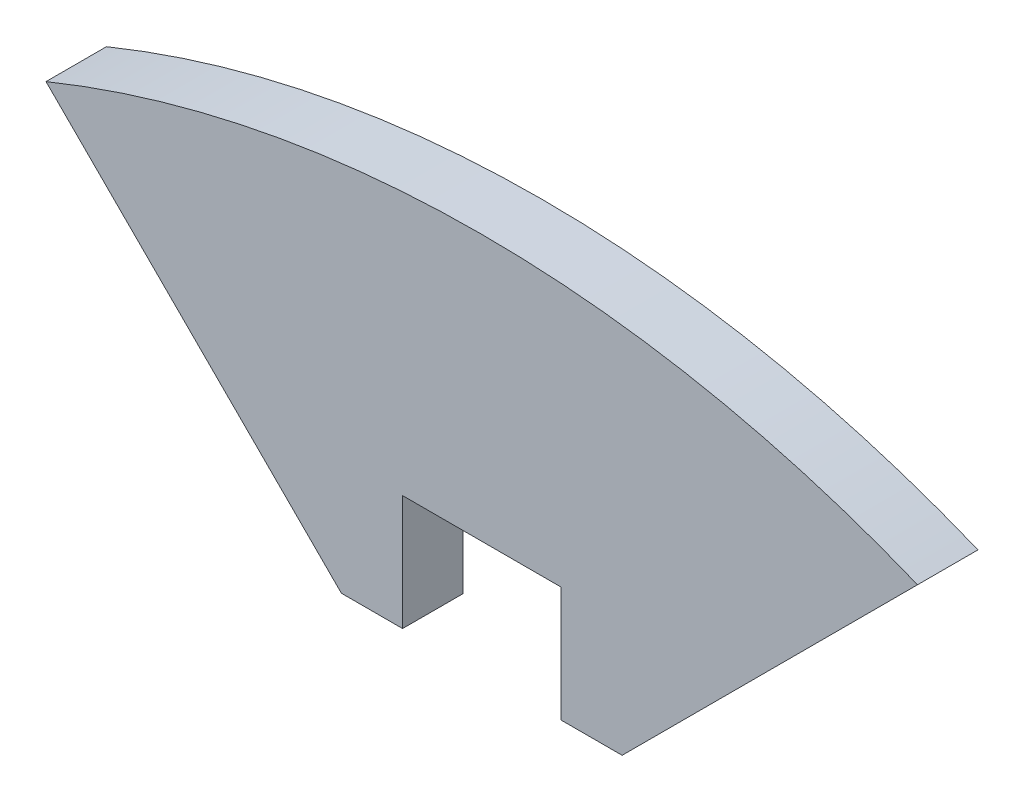
ISO-10303-21;
HEADER;
FILE_DESCRIPTION(('STEP AP214'),'2;1');
FILE_NAME('part.step','',(''),(''),'','','');
FILE_SCHEMA(('AUTOMOTIVE_DESIGN { 1 0 10303 214 1 1 1 1 }'));
ENDSEC;
DATA;
#1=APPLICATION_CONTEXT('core data for automotive mechanical design processes');
#2=APPLICATION_PROTOCOL_DEFINITION('international standard','automotive_design',2000,#1);
#3=PRODUCT_CONTEXT('',#1,'mechanical');
#4=PRODUCT('Part','Part','',(#3));
#5=PRODUCT_RELATED_PRODUCT_CATEGORY('part','',(#4));
#6=PRODUCT_DEFINITION_FORMATION('','',#4);
#7=PRODUCT_DEFINITION_CONTEXT('part definition',#1,'design');
#8=PRODUCT_DEFINITION('design','',#6,#7);
#9=PRODUCT_DEFINITION_SHAPE('','',#8);
#10=(LENGTH_UNIT() NAMED_UNIT(*) SI_UNIT(.MILLI.,.METRE.));
#11=(NAMED_UNIT(*) PLANE_ANGLE_UNIT() SI_UNIT($,.RADIAN.));
#12=(NAMED_UNIT(*) SI_UNIT($,.STERADIAN.) SOLID_ANGLE_UNIT());
#13=UNCERTAINTY_MEASURE_WITH_UNIT(LENGTH_MEASURE(1.E-05),#10,'distance_accuracy_value','');
#14=(GEOMETRIC_REPRESENTATION_CONTEXT(3) GLOBAL_UNCERTAINTY_ASSIGNED_CONTEXT((#13)) GLOBAL_UNIT_ASSIGNED_CONTEXT((#10,
#11,#12)) REPRESENTATION_CONTEXT('',''));
#15=CARTESIAN_POINT('',(0.,0.,0.));
#16=DIRECTION('',(0.,0.,1.));
#17=DIRECTION('',(1.,0.,0.));
#18=AXIS2_PLACEMENT_3D('',#15,#16,#17);
#19=CARTESIAN_POINT('',(4.87500000000008,-26.7659276651081,2.1));
#20=DIRECTION('',(0.,0.,-1.));
#21=DIRECTION('',(-1.,0.,0.));
#22=AXIS2_PLACEMENT_3D('',#19,#20,#21);
#23=CYLINDRICAL_SURFACE('',#22,40.);
#24=CARTESIAN_POINT('',(4.87500000000008,-26.7659276651081,0.));
#25=DIRECTION('',(0.,0.,1.));
#26=DIRECTION('',(1.,0.,0.));
#27=AXIS2_PLACEMENT_3D('',#24,#25,#26);
#28=CIRCLE('',#27,40.);
#29=CARTESIAN_POINT('',(-10.2601193950169,10.2601193950167,0.));
#30=VERTEX_POINT('',#29);
#31=CARTESIAN_POINT('',(20.0101193950167,10.2601193950169,0.));
#32=VERTEX_POINT('',#31);
#33=EDGE_CURVE('E173',#30,#32,#28,.F.);
#34=ORIENTED_EDGE('',*,*,#33,.F.);
#35=DIRECTION('',(0.,0.,-1.));
#36=VECTOR('',#35,1.);
#37=CARTESIAN_POINT('',(-10.2601193950169,10.2601193950167,2.1));
#38=LINE('',#37,#36);
#39=CARTESIAN_POINT('',(-10.2601193950169,10.2601193950167,2.1));
#40=VERTEX_POINT('',#39);
#41=EDGE_CURVE('E11',#40,#30,#38,.T.);
#42=ORIENTED_EDGE('',*,*,#41,.F.);
#43=CARTESIAN_POINT('',(4.87500000000008,-26.7659276651081,2.1));
#44=DIRECTION('',(0.,0.,1.));
#45=DIRECTION('',(1.,0.,0.));
#46=AXIS2_PLACEMENT_3D('',#43,#44,#45);
#47=CIRCLE('',#46,40.);
#48=CARTESIAN_POINT('',(20.0101193950167,10.2601193950169,2.1));
#49=VERTEX_POINT('',#48);
#50=EDGE_CURVE('E140',#40,#49,#47,.F.);
#51=ORIENTED_EDGE('',*,*,#50,.T.);
#52=DIRECTION('',(0.,0.,-1.));
#53=VECTOR('',#52,1.);
#54=CARTESIAN_POINT('',(20.0101193950167,10.2601193950169,2.1));
#55=LINE('',#54,#53);
#56=EDGE_CURVE('E92',#49,#32,#55,.T.);
#57=ORIENTED_EDGE('',*,*,#56,.T.);
#58=EDGE_LOOP('',(#34,#42,#51,#57));
#59=FACE_BOUND('',#58,.T.);
#60=ADVANCED_FACE('F41',(#59),#23,.T.);
#61=CARTESIAN_POINT('',(0.,0.,2.1));
#62=DIRECTION('',(-0.707106781186544,-0.707106781186551,0.));
#63=DIRECTION('',(0.707106781186551,-0.707106781186544,0.));
#64=AXIS2_PLACEMENT_3D('',#61,#62,#63);
#65=PLANE('',#64);
#66=DIRECTION('',(-0.707106781186551,0.707106781186544,0.));
#67=VECTOR('',#66,1.);
#68=CARTESIAN_POINT('',(0.,0.,0.));
#69=LINE('',#68,#67);
#70=CARTESIAN_POINT('',(0.,0.,0.));
#71=VERTEX_POINT('',#70);
#72=EDGE_CURVE('E169',#71,#30,#69,.T.);
#73=ORIENTED_EDGE('',*,*,#72,.F.);
#74=DIRECTION('',(0.,0.,-1.));
#75=VECTOR('',#74,1.);
#76=CARTESIAN_POINT('',(0.,0.,2.1));
#77=LINE('',#76,#75);
#78=CARTESIAN_POINT('',(0.,0.,2.1));
#79=VERTEX_POINT('',#78);
#80=EDGE_CURVE('E49',#79,#71,#77,.T.);
#81=ORIENTED_EDGE('',*,*,#80,.F.);
#82=DIRECTION('',(-0.707106781186551,0.707106781186544,0.));
#83=VECTOR('',#82,1.);
#84=CARTESIAN_POINT('',(0.,0.,2.1));
#85=LINE('',#84,#83);
#86=EDGE_CURVE('E135',#79,#40,#85,.T.);
#87=ORIENTED_EDGE('',*,*,#86,.T.);
#88=ORIENTED_EDGE('',*,*,#41,.T.);
#89=EDGE_LOOP('',(#73,#81,#87,#88));
#90=FACE_BOUND('',#89,.T.);
#91=ADVANCED_FACE('F172',(#90),#65,.T.);
#92=CARTESIAN_POINT('',(0.,0.,2.1));
#93=DIRECTION('',(0.,1.,0.));
#94=DIRECTION('',(0.,0.,1.));
#95=AXIS2_PLACEMENT_3D('',#92,#93,#94);
#96=PLANE('',#95);
#97=DIRECTION('',(1.,0.,0.));
#98=VECTOR('',#97,1.);
#99=CARTESIAN_POINT('',(0.,0.,0.));
#100=LINE('',#99,#98);
#101=CARTESIAN_POINT('',(2.125,0.,0.));
#102=VERTEX_POINT('',#101);
#103=EDGE_CURVE('E149',#71,#102,#100,.T.);
#104=ORIENTED_EDGE('',*,*,#103,.T.);
#105=DIRECTION('',(0.,0.,-1.));
#106=VECTOR('',#105,1.);
#107=CARTESIAN_POINT('',(2.125,0.,2.1));
#108=LINE('',#107,#106);
#109=CARTESIAN_POINT('',(2.125,0.,2.1));
#110=VERTEX_POINT('',#109);
#111=EDGE_CURVE('E159',#110,#102,#108,.T.);
#112=ORIENTED_EDGE('',*,*,#111,.F.);
#113=DIRECTION('',(1.,0.,0.));
#114=VECTOR('',#113,1.);
#115=CARTESIAN_POINT('',(0.,0.,2.1));
#116=LINE('',#115,#114);
#117=EDGE_CURVE('E130',#79,#110,#116,.T.);
#118=ORIENTED_EDGE('',*,*,#117,.F.);
#119=ORIENTED_EDGE('',*,*,#80,.T.);
#120=EDGE_LOOP('',(#104,#112,#118,#119));
#121=FACE_BOUND('',#120,.T.);
#122=ADVANCED_FACE('F163',(#121),#96,.F.);
#123=CARTESIAN_POINT('',(2.125,0.,2.1));
#124=DIRECTION('',(-1.,0.,0.));
#125=DIRECTION('',(0.,0.,1.));
#126=AXIS2_PLACEMENT_3D('',#123,#124,#125);
#127=PLANE('',#126);
#128=DIRECTION('',(0.,1.,0.));
#129=VECTOR('',#128,1.);
#130=CARTESIAN_POINT('',(2.125,0.,0.));
#131=LINE('',#130,#129);
#132=CARTESIAN_POINT('',(2.125,4.,0.));
#133=VERTEX_POINT('',#132);
#134=EDGE_CURVE('E171',#102,#133,#131,.T.);
#135=ORIENTED_EDGE('',*,*,#134,.T.);
#136=DIRECTION('',(0.,0.,-1.));
#137=VECTOR('',#136,1.);
#138=CARTESIAN_POINT('',(2.125,4.,2.1));
#139=LINE('',#138,#137);
#140=CARTESIAN_POINT('',(2.125,4.,2.1));
#141=VERTEX_POINT('',#140);
#142=EDGE_CURVE('E156',#141,#133,#139,.T.);
#143=ORIENTED_EDGE('',*,*,#142,.F.);
#144=DIRECTION('',(0.,1.,0.));
#145=VECTOR('',#144,1.);
#146=CARTESIAN_POINT('',(2.125,0.,2.1));
#147=LINE('',#146,#145);
#148=EDGE_CURVE('E134',#110,#141,#147,.T.);
#149=ORIENTED_EDGE('',*,*,#148,.F.);
#150=ORIENTED_EDGE('',*,*,#111,.T.);
#151=EDGE_LOOP('',(#135,#143,#149,#150));
#152=FACE_BOUND('',#151,.T.);
#153=ADVANCED_FACE('F188',(#152),#127,.F.);
#154=CARTESIAN_POINT('',(0.,4.,2.1));
#155=DIRECTION('',(0.,1.,0.));
#156=DIRECTION('',(0.,0.,1.));
#157=AXIS2_PLACEMENT_3D('',#154,#155,#156);
#158=PLANE('',#157);
#159=DIRECTION('',(1.,0.,0.));
#160=VECTOR('',#159,1.);
#161=CARTESIAN_POINT('',(0.,4.,0.));
#162=LINE('',#161,#160);
#163=CARTESIAN_POINT('',(7.625,4.,0.));
#164=VERTEX_POINT('',#163);
#165=EDGE_CURVE('E177',#133,#164,#162,.T.);
#166=ORIENTED_EDGE('',*,*,#165,.T.);
#167=DIRECTION('',(0.,0.,-1.));
#168=VECTOR('',#167,1.);
#169=CARTESIAN_POINT('',(7.625,4.,2.1));
#170=LINE('',#169,#168);
#171=CARTESIAN_POINT('',(7.625,4.,2.1));
#172=VERTEX_POINT('',#171);
#173=EDGE_CURVE('E125',#172,#164,#170,.T.);
#174=ORIENTED_EDGE('',*,*,#173,.F.);
#175=DIRECTION('',(1.,0.,0.));
#176=VECTOR('',#175,1.);
#177=CARTESIAN_POINT('',(0.,4.,2.1));
#178=LINE('',#177,#176);
#179=EDGE_CURVE('E116',#141,#172,#178,.T.);
#180=ORIENTED_EDGE('',*,*,#179,.F.);
#181=ORIENTED_EDGE('',*,*,#142,.T.);
#182=EDGE_LOOP('',(#166,#174,#180,#181));
#183=FACE_BOUND('',#182,.T.);
#184=ADVANCED_FACE('F179',(#183),#158,.F.);
#185=CARTESIAN_POINT('',(7.625,0.,2.1));
#186=DIRECTION('',(1.,0.,0.));
#187=DIRECTION('',(0.,1.,0.));
#188=AXIS2_PLACEMENT_3D('',#185,#186,#187);
#189=PLANE('',#188);
#190=DIRECTION('',(0.,-1.,0.));
#191=VECTOR('',#190,1.);
#192=CARTESIAN_POINT('',(7.625,0.,0.));
#193=LINE('',#192,#191);
#194=CARTESIAN_POINT('',(7.625,0.,0.));
#195=VERTEX_POINT('',#194);
#196=EDGE_CURVE('E124',#164,#195,#193,.T.);
#197=ORIENTED_EDGE('',*,*,#196,.T.);
#198=DIRECTION('',(0.,0.,-1.));
#199=VECTOR('',#198,1.);
#200=CARTESIAN_POINT('',(7.625,0.,2.1));
#201=LINE('',#200,#199);
#202=CARTESIAN_POINT('',(7.625,0.,2.1));
#203=VERTEX_POINT('',#202);
#204=EDGE_CURVE('E121',#203,#195,#201,.T.);
#205=ORIENTED_EDGE('',*,*,#204,.F.);
#206=DIRECTION('',(0.,-1.,0.));
#207=VECTOR('',#206,1.);
#208=CARTESIAN_POINT('',(7.625,0.,2.1));
#209=LINE('',#208,#207);
#210=EDGE_CURVE('E110',#172,#203,#209,.T.);
#211=ORIENTED_EDGE('',*,*,#210,.F.);
#212=ORIENTED_EDGE('',*,*,#173,.T.);
#213=EDGE_LOOP('',(#197,#205,#211,#212));
#214=FACE_BOUND('',#213,.T.);
#215=ADVANCED_FACE('F122',(#214),#189,.F.);
#216=CARTESIAN_POINT('',(9.75,0.,0.));
#217=VERTEX_POINT('',#216);
#218=EDGE_CURVE('E85',#195,#217,#100,.T.);
#219=ORIENTED_EDGE('',*,*,#218,.T.);
#220=DIRECTION('',(0.,0.,-1.));
#221=VECTOR('',#220,1.);
#222=CARTESIAN_POINT('',(9.75,0.,2.1));
#223=LINE('',#222,#221);
#224=CARTESIAN_POINT('',(9.75,0.,2.1));
#225=VERTEX_POINT('',#224);
#226=EDGE_CURVE('E126',#225,#217,#223,.T.);
#227=ORIENTED_EDGE('',*,*,#226,.F.);
#228=EDGE_CURVE('E114',#203,#225,#116,.T.);
#229=ORIENTED_EDGE('',*,*,#228,.F.);
#230=ORIENTED_EDGE('',*,*,#204,.T.);
#231=EDGE_LOOP('',(#219,#227,#229,#230));
#232=FACE_BOUND('',#231,.T.);
#233=ADVANCED_FACE('F128',(#232),#96,.F.);
#234=CARTESIAN_POINT('',(4.87500000000006,-4.875,2.1));
#235=DIRECTION('',(-0.707106781186552,0.707106781186543,0.));
#236=DIRECTION('',(-0.707106781186543,-0.707106781186552,0.));
#237=AXIS2_PLACEMENT_3D('',#234,#235,#236);
#238=PLANE('',#237);
#239=DIRECTION('',(0.707106781186543,0.707106781186552,0.));
#240=VECTOR('',#239,1.);
#241=CARTESIAN_POINT('',(4.87500000000006,-4.875,0.));
#242=LINE('',#241,#240);
#243=EDGE_CURVE('E142',#217,#32,#242,.T.);
#244=ORIENTED_EDGE('',*,*,#243,.T.);
#245=ORIENTED_EDGE('',*,*,#56,.F.);
#246=DIRECTION('',(0.707106781186543,0.707106781186552,0.));
#247=VECTOR('',#246,1.);
#248=CARTESIAN_POINT('',(4.87500000000006,-4.875,2.1));
#249=LINE('',#248,#247);
#250=EDGE_CURVE('E57',#225,#49,#249,.T.);
#251=ORIENTED_EDGE('',*,*,#250,.F.);
#252=ORIENTED_EDGE('',*,*,#226,.T.);
#253=EDGE_LOOP('',(#244,#245,#251,#252));
#254=FACE_BOUND('',#253,.T.);
#255=ADVANCED_FACE('F199',(#254),#238,.F.);
#256=CARTESIAN_POINT('',(0.,0.,2.1));
#257=DIRECTION('',(0.,0.,1.));
#258=DIRECTION('',(1.,0.,0.));
#259=AXIS2_PLACEMENT_3D('',#256,#257,#258);
#260=PLANE('',#259);
#261=ORIENTED_EDGE('',*,*,#50,.F.);
#262=ORIENTED_EDGE('',*,*,#86,.F.);
#263=ORIENTED_EDGE('',*,*,#117,.T.);
#264=ORIENTED_EDGE('',*,*,#148,.T.);
#265=ORIENTED_EDGE('',*,*,#179,.T.);
#266=ORIENTED_EDGE('',*,*,#210,.T.);
#267=ORIENTED_EDGE('',*,*,#228,.T.);
#268=ORIENTED_EDGE('',*,*,#250,.T.);
#269=EDGE_LOOP('',(#261,#262,#263,#264,#265,#266,#267,#268));
#270=FACE_BOUND('',#269,.T.);
#271=ADVANCED_FACE('F112',(#270),#260,.T.);
#272=CARTESIAN_POINT('',(0.,0.,0.));
#273=DIRECTION('',(0.,0.,1.));
#274=DIRECTION('',(1.,0.,0.));
#275=AXIS2_PLACEMENT_3D('',#272,#273,#274);
#276=PLANE('',#275);
#277=ORIENTED_EDGE('',*,*,#33,.T.);
#278=ORIENTED_EDGE('',*,*,#243,.F.);
#279=ORIENTED_EDGE('',*,*,#218,.F.);
#280=ORIENTED_EDGE('',*,*,#196,.F.);
#281=ORIENTED_EDGE('',*,*,#165,.F.);
#282=ORIENTED_EDGE('',*,*,#134,.F.);
#283=ORIENTED_EDGE('',*,*,#103,.F.);
#284=ORIENTED_EDGE('',*,*,#72,.T.);
#285=EDGE_LOOP('',(#277,#278,#279,#280,#281,#282,#283,#284));
#286=FACE_BOUND('',#285,.T.);
#287=ADVANCED_FACE('F168',(#286),#276,.F.);
#288=CLOSED_SHELL('',(#60,#91,#122,#153,#184,#215,#233,#255,#271,#287));
#289=MANIFOLD_SOLID_BREP('B2',#288);
#290=ADVANCED_BREP_SHAPE_REPRESENTATION('',(#18,#289),#14);
#291=SHAPE_DEFINITION_REPRESENTATION(#9,#290);
ENDSEC;
END-ISO-10303-21;
